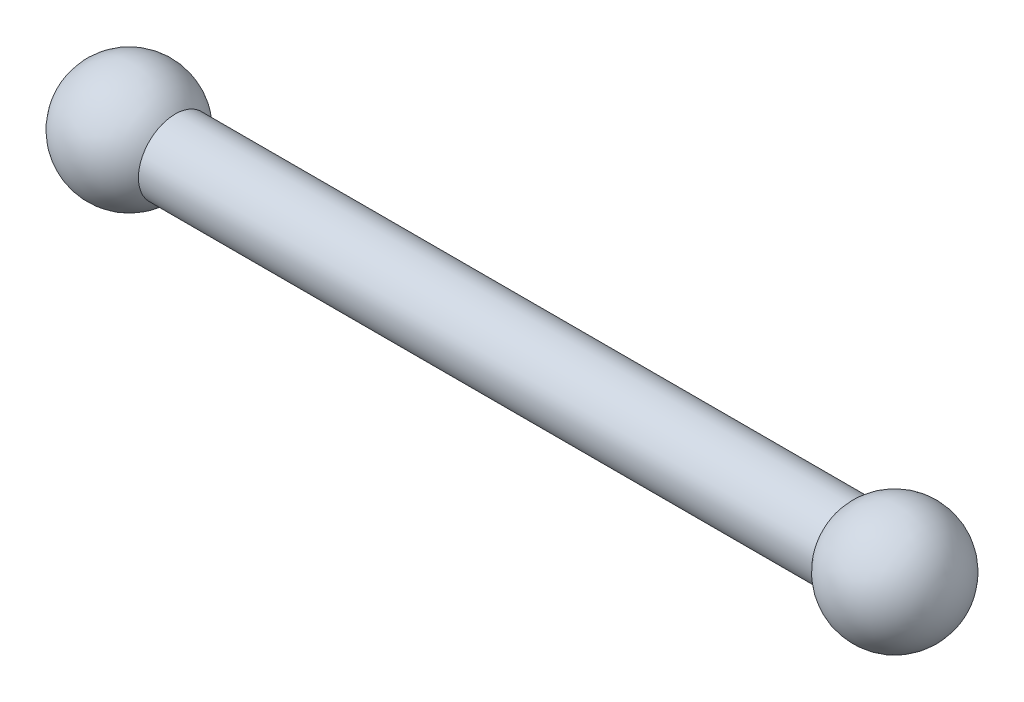
ISO-10303-21;
HEADER;
FILE_DESCRIPTION(('STEP AP214'),'2;1');
FILE_NAME('part.step','',(''),(''),'','','');
FILE_SCHEMA(('AUTOMOTIVE_DESIGN { 1 0 10303 214 1 1 1 1 }'));
ENDSEC;
DATA;
#1=APPLICATION_CONTEXT('core data for automotive mechanical design processes');
#2=APPLICATION_PROTOCOL_DEFINITION('international standard','automotive_design',2000,#1);
#3=PRODUCT_CONTEXT('',#1,'mechanical');
#4=PRODUCT('Part','Part','',(#3));
#5=PRODUCT_RELATED_PRODUCT_CATEGORY('part','',(#4));
#6=PRODUCT_DEFINITION_FORMATION('','',#4);
#7=PRODUCT_DEFINITION_CONTEXT('part definition',#1,'design');
#8=PRODUCT_DEFINITION('design','',#6,#7);
#9=PRODUCT_DEFINITION_SHAPE('','',#8);
#10=(LENGTH_UNIT() NAMED_UNIT(*) SI_UNIT(.MILLI.,.METRE.));
#11=(NAMED_UNIT(*) PLANE_ANGLE_UNIT() SI_UNIT($,.RADIAN.));
#12=(NAMED_UNIT(*) SI_UNIT($,.STERADIAN.) SOLID_ANGLE_UNIT());
#13=UNCERTAINTY_MEASURE_WITH_UNIT(LENGTH_MEASURE(1.E-05),#10,'distance_accuracy_value','');
#14=(GEOMETRIC_REPRESENTATION_CONTEXT(3) GLOBAL_UNCERTAINTY_ASSIGNED_CONTEXT((#13)) GLOBAL_UNIT_ASSIGNED_CONTEXT((#10,
#11,#12)) REPRESENTATION_CONTEXT('',''));
#15=CARTESIAN_POINT('',(0.,0.,0.));
#16=DIRECTION('',(0.,0.,1.));
#17=DIRECTION('',(1.,0.,0.));
#18=AXIS2_PLACEMENT_3D('',#15,#16,#17);
#19=CARTESIAN_POINT('',(0.,0.,0.));
#20=DIRECTION('',(-1.,0.,0.));
#21=DIRECTION('',(0.,0.,1.));
#22=AXIS2_PLACEMENT_3D('',#19,#20,#21);
#23=CYLINDRICAL_SURFACE('',#22,12.7);
#24=CARTESIAN_POINT('',(116.217705084068,0.,0.));
#25=DIRECTION('',(-1.,0.,0.));
#26=DIRECTION('',(0.,0.,1.));
#27=AXIS2_PLACEMENT_3D('',#24,#25,#26);
#28=CIRCLE('',#27,12.7);
#29=CARTESIAN_POINT('',(116.217705084068,0.,12.7));
#30=VERTEX_POINT('',#29);
#31=EDGE_CURVE('E10',#30,#30,#28,.T.);
#32=ORIENTED_EDGE('',*,*,#31,.T.);
#33=EDGE_LOOP('',(#32));
#34=FACE_BOUND('',#33,.T.);
#35=CARTESIAN_POINT('',(-116.217705084068,0.,0.));
#36=DIRECTION('',(-1.,0.,0.));
#37=DIRECTION('',(0.,0.,1.));
#38=AXIS2_PLACEMENT_3D('',#35,#36,#37);
#39=CIRCLE('',#38,12.7);
#40=CARTESIAN_POINT('',(-116.217705084068,0.,12.7));
#41=VERTEX_POINT('',#40);
#42=EDGE_CURVE('E36',#41,#41,#39,.T.);
#43=ORIENTED_EDGE('',*,*,#42,.F.);
#44=EDGE_LOOP('',(#43));
#45=FACE_BOUND('',#44,.T.);
#46=ADVANCED_FACE('F30',(#34,#45),#23,.T.);
#47=CARTESIAN_POINT('',(132.08,0.,0.));
#48=DIRECTION('',(-1.,0.,0.));
#49=DIRECTION('',(0.,1.,0.));
#50=AXIS2_PLACEMENT_3D('',#47,#48,#49);
#51=SPHERICAL_SURFACE('',#50,20.32);
#52=ORIENTED_EDGE('',*,*,#31,.F.);
#53=EDGE_LOOP('',(#52));
#54=FACE_BOUND('',#53,.T.);
#55=ADVANCED_FACE('F45',(#54),#51,.T.);
#56=CARTESIAN_POINT('',(-132.08,0.,0.));
#57=DIRECTION('',(1.,0.,0.));
#58=DIRECTION('',(0.,1.,0.));
#59=AXIS2_PLACEMENT_3D('',#56,#57,#58);
#60=SPHERICAL_SURFACE('',#59,20.32);
#61=ORIENTED_EDGE('',*,*,#42,.T.);
#62=EDGE_LOOP('',(#61));
#63=FACE_BOUND('',#62,.T.);
#64=ADVANCED_FACE('F42',(#63),#60,.T.);
#65=CLOSED_SHELL('',(#46,#55,#64));
#66=MANIFOLD_SOLID_BREP('B2',#65);
#67=ADVANCED_BREP_SHAPE_REPRESENTATION('',(#18,#66),#14);
#68=SHAPE_DEFINITION_REPRESENTATION(#9,#67);
ENDSEC;
END-ISO-10303-21;
